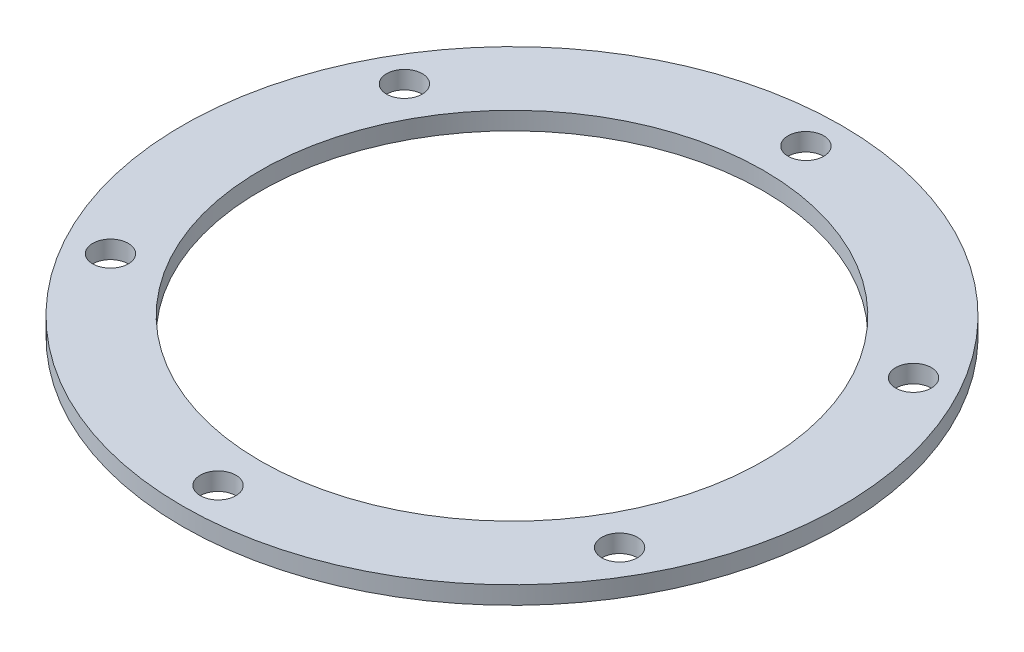
ISO-10303-21;
HEADER;
FILE_DESCRIPTION(('STEP AP214'),'2;1');
FILE_NAME('part.step','',(''),(''),'','','');
FILE_SCHEMA(('AUTOMOTIVE_DESIGN { 1 0 10303 214 1 1 1 1 }'));
ENDSEC;
DATA;
#1=APPLICATION_CONTEXT('core data for automotive mechanical design processes');
#2=APPLICATION_PROTOCOL_DEFINITION('international standard','automotive_design',2000,#1);
#3=PRODUCT_CONTEXT('',#1,'mechanical');
#4=PRODUCT('Part','Part','',(#3));
#5=PRODUCT_RELATED_PRODUCT_CATEGORY('part','',(#4));
#6=PRODUCT_DEFINITION_FORMATION('','',#4);
#7=PRODUCT_DEFINITION_CONTEXT('part definition',#1,'design');
#8=PRODUCT_DEFINITION('design','',#6,#7);
#9=PRODUCT_DEFINITION_SHAPE('','',#8);
#10=(LENGTH_UNIT() NAMED_UNIT(*) SI_UNIT(.MILLI.,.METRE.));
#11=(NAMED_UNIT(*) PLANE_ANGLE_UNIT() SI_UNIT($,.RADIAN.));
#12=(NAMED_UNIT(*) SI_UNIT($,.STERADIAN.) SOLID_ANGLE_UNIT());
#13=UNCERTAINTY_MEASURE_WITH_UNIT(LENGTH_MEASURE(1.E-05),#10,'distance_accuracy_value','');
#14=(GEOMETRIC_REPRESENTATION_CONTEXT(3) GLOBAL_UNCERTAINTY_ASSIGNED_CONTEXT((#13)) GLOBAL_UNIT_ASSIGNED_CONTEXT((#10,
#11,#12)) REPRESENTATION_CONTEXT('',''));
#15=CARTESIAN_POINT('',(0.,0.,0.));
#16=DIRECTION('',(0.,0.,1.));
#17=DIRECTION('',(1.,0.,0.));
#18=AXIS2_PLACEMENT_3D('',#15,#16,#17);
#19=CARTESIAN_POINT('',(0.,2.,0.));
#20=DIRECTION('',(0.,1.,0.));
#21=DIRECTION('',(0.,0.,1.));
#22=AXIS2_PLACEMENT_3D('',#19,#20,#21);
#23=PLANE('',#22);
#24=CARTESIAN_POINT('',(0.,2.,33.));
#25=DIRECTION('',(0.,1.,0.));
#26=DIRECTION('',(0.,0.,1.));
#27=AXIS2_PLACEMENT_3D('',#24,#25,#26);
#28=CIRCLE('',#27,2.00000000000001);
#29=CARTESIAN_POINT('',(0.,2.,35.));
#30=VERTEX_POINT('',#29);
#31=EDGE_CURVE('E77',#30,#30,#28,.T.);
#32=ORIENTED_EDGE('',*,*,#31,.F.);
#33=EDGE_LOOP('',(#32));
#34=FACE_BOUND('',#33,.T.);
#35=CARTESIAN_POINT('',(28.5788383248865,2.,-16.5));
#36=DIRECTION('',(0.,1.,0.));
#37=DIRECTION('',(0.,0.,1.));
#38=AXIS2_PLACEMENT_3D('',#35,#36,#37);
#39=CIRCLE('',#38,2.00000000000001);
#40=CARTESIAN_POINT('',(28.5788383248865,2.,-14.5));
#41=VERTEX_POINT('',#40);
#42=EDGE_CURVE('E65',#41,#41,#39,.T.);
#43=ORIENTED_EDGE('',*,*,#42,.F.);
#44=EDGE_LOOP('',(#43));
#45=FACE_BOUND('',#44,.T.);
#46=CARTESIAN_POINT('',(0.,2.,-33.));
#47=DIRECTION('',(0.,1.,0.));
#48=DIRECTION('',(0.,0.,1.));
#49=AXIS2_PLACEMENT_3D('',#46,#47,#48);
#50=CIRCLE('',#49,2.00000000000001);
#51=CARTESIAN_POINT('',(0.,2.,-31.));
#52=VERTEX_POINT('',#51);
#53=EDGE_CURVE('E53',#52,#52,#50,.T.);
#54=ORIENTED_EDGE('',*,*,#53,.F.);
#55=EDGE_LOOP('',(#54));
#56=FACE_BOUND('',#55,.T.);
#57=CARTESIAN_POINT('',(0.,2.,0.));
#58=DIRECTION('',(0.,1.,0.));
#59=DIRECTION('',(0.,0.,1.));
#60=AXIS2_PLACEMENT_3D('',#57,#58,#59);
#61=CIRCLE('',#60,37.);
#62=CARTESIAN_POINT('',(0.,2.,37.));
#63=VERTEX_POINT('',#62);
#64=EDGE_CURVE('E10',#63,#63,#61,.T.);
#65=ORIENTED_EDGE('',*,*,#64,.T.);
#66=EDGE_LOOP('',(#65));
#67=FACE_BOUND('',#66,.T.);
#68=CARTESIAN_POINT('',(0.,2.,0.));
#69=DIRECTION('',(0.,1.,0.));
#70=DIRECTION('',(0.,0.,1.));
#71=AXIS2_PLACEMENT_3D('',#68,#69,#70);
#72=CIRCLE('',#71,28.25);
#73=CARTESIAN_POINT('',(0.,2.,28.25));
#74=VERTEX_POINT('',#73);
#75=EDGE_CURVE('E48',#74,#74,#72,.T.);
#76=ORIENTED_EDGE('',*,*,#75,.F.);
#77=EDGE_LOOP('',(#76));
#78=FACE_BOUND('',#77,.T.);
#79=CARTESIAN_POINT('',(-28.5788383248865,2.,16.5));
#80=DIRECTION('',(0.,1.,0.));
#81=DIRECTION('',(0.,0.,1.));
#82=AXIS2_PLACEMENT_3D('',#79,#80,#81);
#83=CIRCLE('',#82,2.00000000000001);
#84=CARTESIAN_POINT('',(-28.5788383248865,2.,18.5));
#85=VERTEX_POINT('',#84);
#86=EDGE_CURVE('E59',#85,#85,#83,.T.);
#87=ORIENTED_EDGE('',*,*,#86,.F.);
#88=EDGE_LOOP('',(#87));
#89=FACE_BOUND('',#88,.T.);
#90=CARTESIAN_POINT('',(28.5788383248865,2.,16.5));
#91=DIRECTION('',(0.,1.,0.));
#92=DIRECTION('',(0.,0.,1.));
#93=AXIS2_PLACEMENT_3D('',#90,#91,#92);
#94=CIRCLE('',#93,2.00000000000012);
#95=CARTESIAN_POINT('',(28.5788383248865,2.,18.5000000000001));
#96=VERTEX_POINT('',#95);
#97=EDGE_CURVE('E71',#96,#96,#94,.T.);
#98=ORIENTED_EDGE('',*,*,#97,.F.);
#99=EDGE_LOOP('',(#98));
#100=FACE_BOUND('',#99,.T.);
#101=CARTESIAN_POINT('',(-28.5788383248865,2.,-16.5));
#102=DIRECTION('',(0.,1.,0.));
#103=DIRECTION('',(0.,0.,1.));
#104=AXIS2_PLACEMENT_3D('',#101,#102,#103);
#105=CIRCLE('',#104,2.00000000000001);
#106=CARTESIAN_POINT('',(-28.5788383248865,2.,-14.5));
#107=VERTEX_POINT('',#106);
#108=EDGE_CURVE('E83',#107,#107,#105,.T.);
#109=ORIENTED_EDGE('',*,*,#108,.F.);
#110=EDGE_LOOP('',(#109));
#111=FACE_BOUND('',#110,.T.);
#112=ADVANCED_FACE('F37',(#34,#45,#56,#67,#78,#89,#100,#111),#23,.T.);
#113=CARTESIAN_POINT('',(0.,0.,0.));
#114=DIRECTION('',(0.,1.,0.));
#115=DIRECTION('',(0.,0.,1.));
#116=AXIS2_PLACEMENT_3D('',#113,#114,#115);
#117=PLANE('',#116);
#118=CARTESIAN_POINT('',(0.,0.,0.));
#119=DIRECTION('',(0.,1.,0.));
#120=DIRECTION('',(0.,0.,1.));
#121=AXIS2_PLACEMENT_3D('',#118,#119,#120);
#122=CIRCLE('',#121,37.);
#123=CARTESIAN_POINT('',(0.,0.,37.));
#124=VERTEX_POINT('',#123);
#125=EDGE_CURVE('E41',#124,#124,#122,.T.);
#126=ORIENTED_EDGE('',*,*,#125,.F.);
#127=EDGE_LOOP('',(#126));
#128=FACE_BOUND('',#127,.T.);
#129=CARTESIAN_POINT('',(0.,0.,0.));
#130=DIRECTION('',(0.,1.,0.));
#131=DIRECTION('',(0.,0.,1.));
#132=AXIS2_PLACEMENT_3D('',#129,#130,#131);
#133=CIRCLE('',#132,28.25);
#134=CARTESIAN_POINT('',(0.,0.,28.25));
#135=VERTEX_POINT('',#134);
#136=EDGE_CURVE('E50',#135,#135,#133,.T.);
#137=ORIENTED_EDGE('',*,*,#136,.T.);
#138=EDGE_LOOP('',(#137));
#139=FACE_BOUND('',#138,.T.);
#140=CARTESIAN_POINT('',(0.,0.,-33.));
#141=DIRECTION('',(0.,1.,0.));
#142=DIRECTION('',(0.,0.,1.));
#143=AXIS2_PLACEMENT_3D('',#140,#141,#142);
#144=CIRCLE('',#143,2.00000000000001);
#145=CARTESIAN_POINT('',(0.,0.,-31.));
#146=VERTEX_POINT('',#145);
#147=EDGE_CURVE('E56',#146,#146,#144,.T.);
#148=ORIENTED_EDGE('',*,*,#147,.T.);
#149=EDGE_LOOP('',(#148));
#150=FACE_BOUND('',#149,.T.);
#151=CARTESIAN_POINT('',(-28.5788383248865,0.,16.5));
#152=DIRECTION('',(0.,1.,0.));
#153=DIRECTION('',(0.,0.,1.));
#154=AXIS2_PLACEMENT_3D('',#151,#152,#153);
#155=CIRCLE('',#154,2.00000000000001);
#156=CARTESIAN_POINT('',(-28.5788383248865,0.,18.5));
#157=VERTEX_POINT('',#156);
#158=EDGE_CURVE('E62',#157,#157,#155,.T.);
#159=ORIENTED_EDGE('',*,*,#158,.T.);
#160=EDGE_LOOP('',(#159));
#161=FACE_BOUND('',#160,.T.);
#162=CARTESIAN_POINT('',(28.5788383248865,0.,-16.5));
#163=DIRECTION('',(0.,1.,0.));
#164=DIRECTION('',(0.,0.,1.));
#165=AXIS2_PLACEMENT_3D('',#162,#163,#164);
#166=CIRCLE('',#165,2.00000000000001);
#167=CARTESIAN_POINT('',(28.5788383248865,0.,-14.5));
#168=VERTEX_POINT('',#167);
#169=EDGE_CURVE('E68',#168,#168,#166,.T.);
#170=ORIENTED_EDGE('',*,*,#169,.T.);
#171=EDGE_LOOP('',(#170));
#172=FACE_BOUND('',#171,.T.);
#173=CARTESIAN_POINT('',(28.5788383248865,0.,16.5));
#174=DIRECTION('',(0.,1.,0.));
#175=DIRECTION('',(0.,0.,1.));
#176=AXIS2_PLACEMENT_3D('',#173,#174,#175);
#177=CIRCLE('',#176,2.00000000000012);
#178=CARTESIAN_POINT('',(28.5788383248865,0.,18.5000000000001));
#179=VERTEX_POINT('',#178);
#180=EDGE_CURVE('E74',#179,#179,#177,.T.);
#181=ORIENTED_EDGE('',*,*,#180,.T.);
#182=EDGE_LOOP('',(#181));
#183=FACE_BOUND('',#182,.T.);
#184=CARTESIAN_POINT('',(0.,0.,33.));
#185=DIRECTION('',(0.,1.,0.));
#186=DIRECTION('',(0.,0.,1.));
#187=AXIS2_PLACEMENT_3D('',#184,#185,#186);
#188=CIRCLE('',#187,2.00000000000001);
#189=CARTESIAN_POINT('',(0.,0.,35.));
#190=VERTEX_POINT('',#189);
#191=EDGE_CURVE('E80',#190,#190,#188,.T.);
#192=ORIENTED_EDGE('',*,*,#191,.T.);
#193=EDGE_LOOP('',(#192));
#194=FACE_BOUND('',#193,.T.);
#195=CARTESIAN_POINT('',(-28.5788383248865,0.,-16.5));
#196=DIRECTION('',(0.,1.,0.));
#197=DIRECTION('',(0.,0.,1.));
#198=AXIS2_PLACEMENT_3D('',#195,#196,#197);
#199=CIRCLE('',#198,2.00000000000001);
#200=CARTESIAN_POINT('',(-28.5788383248865,0.,-14.5));
#201=VERTEX_POINT('',#200);
#202=EDGE_CURVE('E86',#201,#201,#199,.T.);
#203=ORIENTED_EDGE('',*,*,#202,.T.);
#204=EDGE_LOOP('',(#203));
#205=FACE_BOUND('',#204,.T.);
#206=ADVANCED_FACE('F96',(#128,#139,#150,#161,#172,#183,#194,#205),#117,.F.);
#207=CARTESIAN_POINT('',(0.,2.,0.));
#208=DIRECTION('',(0.,-1.,0.));
#209=DIRECTION('',(0.,0.,-1.));
#210=AXIS2_PLACEMENT_3D('',#207,#208,#209);
#211=CYLINDRICAL_SURFACE('',#210,37.);
#212=ORIENTED_EDGE('',*,*,#64,.F.);
#213=EDGE_LOOP('',(#212));
#214=FACE_BOUND('',#213,.T.);
#215=ORIENTED_EDGE('',*,*,#125,.T.);
#216=EDGE_LOOP('',(#215));
#217=FACE_BOUND('',#216,.T.);
#218=ADVANCED_FACE('F39',(#214,#217),#211,.T.);
#219=CARTESIAN_POINT('',(0.,2.,0.));
#220=DIRECTION('',(0.,-1.,0.));
#221=DIRECTION('',(0.,0.,-1.));
#222=AXIS2_PLACEMENT_3D('',#219,#220,#221);
#223=CYLINDRICAL_SURFACE('',#222,28.25);
#224=ORIENTED_EDGE('',*,*,#75,.T.);
#225=EDGE_LOOP('',(#224));
#226=FACE_BOUND('',#225,.T.);
#227=ORIENTED_EDGE('',*,*,#136,.F.);
#228=EDGE_LOOP('',(#227));
#229=FACE_BOUND('',#228,.T.);
#230=ADVANCED_FACE('F106',(#226,#229),#223,.F.);
#231=CARTESIAN_POINT('',(0.,2.,-33.));
#232=DIRECTION('',(0.,-1.,0.));
#233=DIRECTION('',(0.,0.,-1.));
#234=AXIS2_PLACEMENT_3D('',#231,#232,#233);
#235=CYLINDRICAL_SURFACE('',#234,2.00000000000001);
#236=ORIENTED_EDGE('',*,*,#53,.T.);
#237=EDGE_LOOP('',(#236));
#238=FACE_BOUND('',#237,.T.);
#239=ORIENTED_EDGE('',*,*,#147,.F.);
#240=EDGE_LOOP('',(#239));
#241=FACE_BOUND('',#240,.T.);
#242=ADVANCED_FACE('F109',(#238,#241),#235,.F.);
#243=CARTESIAN_POINT('',(-28.5788383248865,2.,16.5));
#244=DIRECTION('',(0.,-1.,0.));
#245=DIRECTION('',(0.,0.,-1.));
#246=AXIS2_PLACEMENT_3D('',#243,#244,#245);
#247=CYLINDRICAL_SURFACE('',#246,2.00000000000001);
#248=ORIENTED_EDGE('',*,*,#86,.T.);
#249=EDGE_LOOP('',(#248));
#250=FACE_BOUND('',#249,.T.);
#251=ORIENTED_EDGE('',*,*,#158,.F.);
#252=EDGE_LOOP('',(#251));
#253=FACE_BOUND('',#252,.T.);
#254=ADVANCED_FACE('F113',(#250,#253),#247,.F.);
#255=CARTESIAN_POINT('',(28.5788383248865,2.,-16.5));
#256=DIRECTION('',(0.,-1.,0.));
#257=DIRECTION('',(0.,0.,-1.));
#258=AXIS2_PLACEMENT_3D('',#255,#256,#257);
#259=CYLINDRICAL_SURFACE('',#258,2.00000000000001);
#260=ORIENTED_EDGE('',*,*,#42,.T.);
#261=EDGE_LOOP('',(#260));
#262=FACE_BOUND('',#261,.T.);
#263=ORIENTED_EDGE('',*,*,#169,.F.);
#264=EDGE_LOOP('',(#263));
#265=FACE_BOUND('',#264,.T.);
#266=ADVANCED_FACE('F117',(#262,#265),#259,.F.);
#267=CARTESIAN_POINT('',(28.5788383248865,2.,16.5));
#268=DIRECTION('',(0.,-1.,0.));
#269=DIRECTION('',(0.,0.,-1.));
#270=AXIS2_PLACEMENT_3D('',#267,#268,#269);
#271=CYLINDRICAL_SURFACE('',#270,2.00000000000012);
#272=ORIENTED_EDGE('',*,*,#97,.T.);
#273=EDGE_LOOP('',(#272));
#274=FACE_BOUND('',#273,.T.);
#275=ORIENTED_EDGE('',*,*,#180,.F.);
#276=EDGE_LOOP('',(#275));
#277=FACE_BOUND('',#276,.T.);
#278=ADVANCED_FACE('F121',(#274,#277),#271,.F.);
#279=CARTESIAN_POINT('',(0.,2.,33.));
#280=DIRECTION('',(0.,-1.,0.));
#281=DIRECTION('',(0.,0.,-1.));
#282=AXIS2_PLACEMENT_3D('',#279,#280,#281);
#283=CYLINDRICAL_SURFACE('',#282,2.00000000000001);
#284=ORIENTED_EDGE('',*,*,#31,.T.);
#285=EDGE_LOOP('',(#284));
#286=FACE_BOUND('',#285,.T.);
#287=ORIENTED_EDGE('',*,*,#191,.F.);
#288=EDGE_LOOP('',(#287));
#289=FACE_BOUND('',#288,.T.);
#290=ADVANCED_FACE('F125',(#286,#289),#283,.F.);
#291=CARTESIAN_POINT('',(-28.5788383248865,2.,-16.5));
#292=DIRECTION('',(0.,-1.,0.));
#293=DIRECTION('',(0.,0.,-1.));
#294=AXIS2_PLACEMENT_3D('',#291,#292,#293);
#295=CYLINDRICAL_SURFACE('',#294,2.00000000000001);
#296=ORIENTED_EDGE('',*,*,#108,.T.);
#297=EDGE_LOOP('',(#296));
#298=FACE_BOUND('',#297,.T.);
#299=ORIENTED_EDGE('',*,*,#202,.F.);
#300=EDGE_LOOP('',(#299));
#301=FACE_BOUND('',#300,.T.);
#302=ADVANCED_FACE('F92',(#298,#301),#295,.F.);
#303=CLOSED_SHELL('',(#112,#206,#218,#230,#242,#254,#266,#278,#290,#302));
#304=MANIFOLD_SOLID_BREP('B2',#303);
#305=ADVANCED_BREP_SHAPE_REPRESENTATION('',(#18,#304),#14);
#306=SHAPE_DEFINITION_REPRESENTATION(#9,#305);
ENDSEC;
END-ISO-10303-21;
